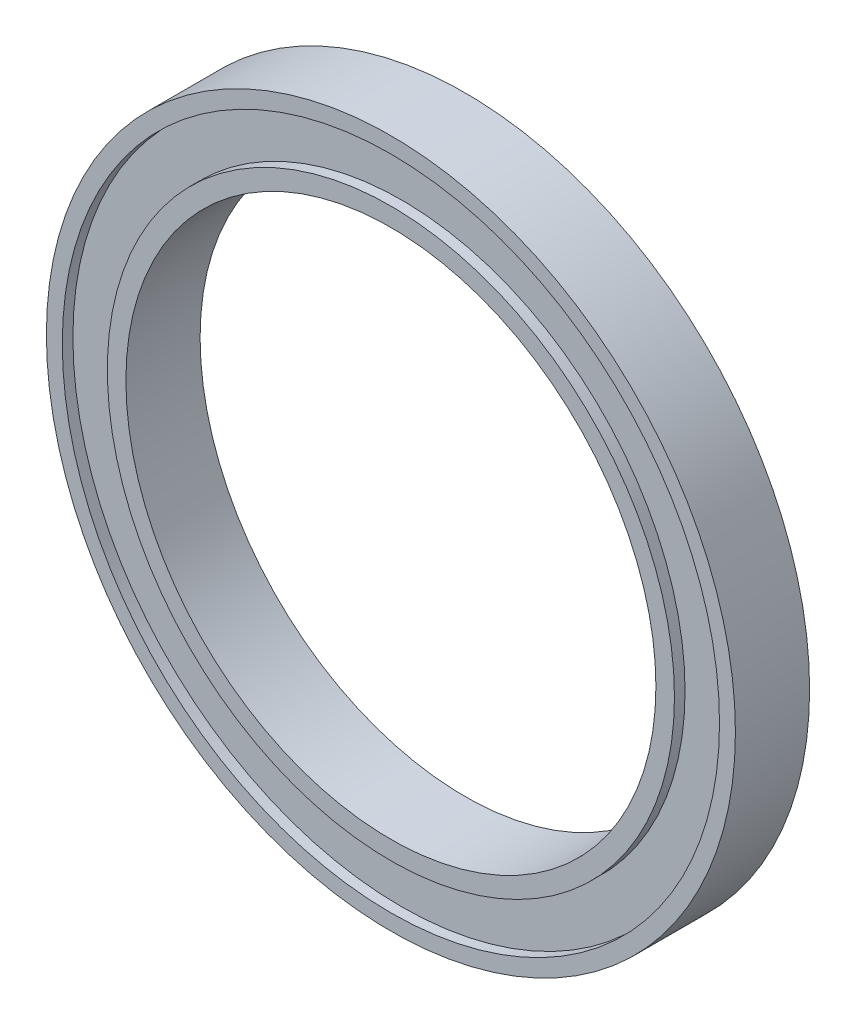
ISO-10303-21;
HEADER;
FILE_DESCRIPTION(('STEP AP214'),'2;1');
FILE_NAME('part.step','',(''),(''),'','','');
FILE_SCHEMA(('AUTOMOTIVE_DESIGN { 1 0 10303 214 1 1 1 1 }'));
ENDSEC;
DATA;
#1=APPLICATION_CONTEXT('core data for automotive mechanical design processes');
#2=APPLICATION_PROTOCOL_DEFINITION('international standard','automotive_design',2000,#1);
#3=PRODUCT_CONTEXT('',#1,'mechanical');
#4=PRODUCT('Part','Part','',(#3));
#5=PRODUCT_RELATED_PRODUCT_CATEGORY('part','',(#4));
#6=PRODUCT_DEFINITION_FORMATION('','',#4);
#7=PRODUCT_DEFINITION_CONTEXT('part definition',#1,'design');
#8=PRODUCT_DEFINITION('design','',#6,#7);
#9=PRODUCT_DEFINITION_SHAPE('','',#8);
#10=(LENGTH_UNIT() NAMED_UNIT(*) SI_UNIT(.MILLI.,.METRE.));
#11=(NAMED_UNIT(*) PLANE_ANGLE_UNIT() SI_UNIT($,.RADIAN.));
#12=(NAMED_UNIT(*) SI_UNIT($,.STERADIAN.) SOLID_ANGLE_UNIT());
#13=UNCERTAINTY_MEASURE_WITH_UNIT(LENGTH_MEASURE(1.E-05),#10,'distance_accuracy_value','');
#14=(GEOMETRIC_REPRESENTATION_CONTEXT(3) GLOBAL_UNCERTAINTY_ASSIGNED_CONTEXT((#13)) GLOBAL_UNIT_ASSIGNED_CONTEXT((#10,
#11,#12)) REPRESENTATION_CONTEXT('',''));
#15=CARTESIAN_POINT('',(0.,0.,0.));
#16=DIRECTION('',(0.,0.,1.));
#17=DIRECTION('',(1.,0.,0.));
#18=AXIS2_PLACEMENT_3D('',#15,#16,#17);
#19=CARTESIAN_POINT('',(0.,0.,-3.5));
#20=DIRECTION('',(0.,0.,1.));
#21=DIRECTION('',(1.,0.,0.));
#22=AXIS2_PLACEMENT_3D('',#19,#20,#21);
#23=PLANE('',#22);
#24=CARTESIAN_POINT('',(0.,0.,-3.5));
#25=DIRECTION('',(0.,0.,1.));
#26=DIRECTION('',(1.,0.,0.));
#27=AXIS2_PLACEMENT_3D('',#24,#25,#26);
#28=CIRCLE('',#27,25.);
#29=CARTESIAN_POINT('',(25.,0.,-3.5));
#30=VERTEX_POINT('',#29);
#31=EDGE_CURVE('E46',#30,#30,#28,.T.);
#32=ORIENTED_EDGE('',*,*,#31,.T.);
#33=EDGE_LOOP('',(#32));
#34=FACE_BOUND('',#33,.T.);
#35=CARTESIAN_POINT('',(0.,0.,-3.5));
#36=DIRECTION('',(0.,0.,1.));
#37=DIRECTION('',(1.,0.,0.));
#38=AXIS2_PLACEMENT_3D('',#35,#36,#37);
#39=CIRCLE('',#38,26.75);
#40=CARTESIAN_POINT('',(26.75,0.,-3.5));
#41=VERTEX_POINT('',#40);
#42=EDGE_CURVE('E70',#41,#41,#39,.T.);
#43=ORIENTED_EDGE('',*,*,#42,.F.);
#44=EDGE_LOOP('',(#43));
#45=FACE_BOUND('',#44,.T.);
#46=ADVANCED_FACE('F33',(#34,#45),#23,.F.);
#47=CARTESIAN_POINT('',(0.,0.,3.5));
#48=DIRECTION('',(0.,0.,1.));
#49=DIRECTION('',(1.,0.,0.));
#50=AXIS2_PLACEMENT_3D('',#47,#48,#49);
#51=PLANE('',#50);
#52=CARTESIAN_POINT('',(0.,0.,3.5));
#53=DIRECTION('',(0.,0.,1.));
#54=DIRECTION('',(1.,0.,0.));
#55=AXIS2_PLACEMENT_3D('',#52,#53,#54);
#56=CIRCLE('',#55,25.);
#57=CARTESIAN_POINT('',(25.,0.,3.5));
#58=VERTEX_POINT('',#57);
#59=EDGE_CURVE('E44',#58,#58,#56,.T.);
#60=ORIENTED_EDGE('',*,*,#59,.F.);
#61=EDGE_LOOP('',(#60));
#62=FACE_BOUND('',#61,.T.);
#63=CARTESIAN_POINT('',(0.,0.,3.5));
#64=DIRECTION('',(0.,0.,1.));
#65=DIRECTION('',(1.,0.,0.));
#66=AXIS2_PLACEMENT_3D('',#63,#64,#65);
#67=CIRCLE('',#66,26.75);
#68=CARTESIAN_POINT('',(26.75,0.,3.5));
#69=VERTEX_POINT('',#68);
#70=EDGE_CURVE('E58',#69,#69,#67,.T.);
#71=ORIENTED_EDGE('',*,*,#70,.T.);
#72=EDGE_LOOP('',(#71));
#73=FACE_BOUND('',#72,.T.);
#74=ADVANCED_FACE('F86',(#62,#73),#51,.T.);
#75=CARTESIAN_POINT('',(0.,0.,3.5));
#76=DIRECTION('',(0.,0.,1.));
#77=DIRECTION('',(1.,0.,0.));
#78=AXIS2_PLACEMENT_3D('',#75,#76,#77);
#79=CIRCLE('',#78,31.);
#80=CARTESIAN_POINT('',(31.,0.,3.5));
#81=VERTEX_POINT('',#80);
#82=EDGE_CURVE('E52',#81,#81,#79,.T.);
#83=ORIENTED_EDGE('',*,*,#82,.F.);
#84=EDGE_LOOP('',(#83));
#85=FACE_BOUND('',#84,.T.);
#86=CARTESIAN_POINT('',(0.,0.,3.5));
#87=DIRECTION('',(0.,0.,1.));
#88=DIRECTION('',(1.,0.,0.));
#89=AXIS2_PLACEMENT_3D('',#86,#87,#88);
#90=CIRCLE('',#89,32.5);
#91=CARTESIAN_POINT('',(32.5,0.,3.5));
#92=VERTEX_POINT('',#91);
#93=EDGE_CURVE('E10',#92,#92,#90,.T.);
#94=ORIENTED_EDGE('',*,*,#93,.T.);
#95=EDGE_LOOP('',(#94));
#96=FACE_BOUND('',#95,.T.);
#97=ADVANCED_FACE('F92',(#85,#96),#51,.T.);
#98=CARTESIAN_POINT('',(0.,0.,-3.5));
#99=DIRECTION('',(0.,0.,1.));
#100=DIRECTION('',(1.,0.,0.));
#101=AXIS2_PLACEMENT_3D('',#98,#99,#100);
#102=CIRCLE('',#101,31.);
#103=CARTESIAN_POINT('',(31.,0.,-3.5));
#104=VERTEX_POINT('',#103);
#105=EDGE_CURVE('E64',#104,#104,#102,.T.);
#106=ORIENTED_EDGE('',*,*,#105,.T.);
#107=EDGE_LOOP('',(#106));
#108=FACE_BOUND('',#107,.T.);
#109=CARTESIAN_POINT('',(0.,0.,-3.5));
#110=DIRECTION('',(0.,0.,1.));
#111=DIRECTION('',(1.,0.,0.));
#112=AXIS2_PLACEMENT_3D('',#109,#110,#111);
#113=CIRCLE('',#112,32.5);
#114=CARTESIAN_POINT('',(32.5,0.,-3.5));
#115=VERTEX_POINT('',#114);
#116=EDGE_CURVE('E37',#115,#115,#113,.T.);
#117=ORIENTED_EDGE('',*,*,#116,.F.);
#118=EDGE_LOOP('',(#117));
#119=FACE_BOUND('',#118,.T.);
#120=ADVANCED_FACE('F88',(#108,#119),#23,.F.);
#121=CARTESIAN_POINT('',(0.,0.,3.5));
#122=DIRECTION('',(0.,0.,-1.));
#123=DIRECTION('',(-1.,0.,0.));
#124=AXIS2_PLACEMENT_3D('',#121,#122,#123);
#125=CYLINDRICAL_SURFACE('',#124,32.5);
#126=ORIENTED_EDGE('',*,*,#93,.F.);
#127=EDGE_LOOP('',(#126));
#128=FACE_BOUND('',#127,.T.);
#129=ORIENTED_EDGE('',*,*,#116,.T.);
#130=EDGE_LOOP('',(#129));
#131=FACE_BOUND('',#130,.T.);
#132=ADVANCED_FACE('F35',(#128,#131),#125,.T.);
#133=CARTESIAN_POINT('',(0.,0.,3.5));
#134=DIRECTION('',(0.,0.,-1.));
#135=DIRECTION('',(-1.,0.,0.));
#136=AXIS2_PLACEMENT_3D('',#133,#134,#135);
#137=CYLINDRICAL_SURFACE('',#136,25.);
#138=ORIENTED_EDGE('',*,*,#59,.T.);
#139=EDGE_LOOP('',(#138));
#140=FACE_BOUND('',#139,.T.);
#141=ORIENTED_EDGE('',*,*,#31,.F.);
#142=EDGE_LOOP('',(#141));
#143=FACE_BOUND('',#142,.T.);
#144=ADVANCED_FACE('F101',(#140,#143),#137,.F.);
#145=CARTESIAN_POINT('',(0.,0.,2.5));
#146=DIRECTION('',(0.,0.,1.));
#147=DIRECTION('',(1.,0.,0.));
#148=AXIS2_PLACEMENT_3D('',#145,#146,#147);
#149=CYLINDRICAL_SURFACE('',#148,31.);
#150=CARTESIAN_POINT('',(0.,0.,2.5));
#151=DIRECTION('',(0.,0.,1.));
#152=DIRECTION('',(1.,0.,0.));
#153=AXIS2_PLACEMENT_3D('',#150,#151,#152);
#154=CIRCLE('',#153,31.);
#155=CARTESIAN_POINT('',(31.,0.,2.5));
#156=VERTEX_POINT('',#155);
#157=EDGE_CURVE('E49',#156,#156,#154,.T.);
#158=ORIENTED_EDGE('',*,*,#157,.F.);
#159=EDGE_LOOP('',(#158));
#160=FACE_BOUND('',#159,.T.);
#161=ORIENTED_EDGE('',*,*,#82,.T.);
#162=EDGE_LOOP('',(#161));
#163=FACE_BOUND('',#162,.T.);
#164=ADVANCED_FACE('F125',(#160,#163),#149,.F.);
#165=CARTESIAN_POINT('',(0.,0.,2.5));
#166=DIRECTION('',(0.,0.,1.));
#167=DIRECTION('',(1.,0.,0.));
#168=AXIS2_PLACEMENT_3D('',#165,#166,#167);
#169=PLANE('',#168);
#170=CARTESIAN_POINT('',(0.,0.,2.5));
#171=DIRECTION('',(0.,0.,1.));
#172=DIRECTION('',(1.,0.,0.));
#173=AXIS2_PLACEMENT_3D('',#170,#171,#172);
#174=CIRCLE('',#173,26.75);
#175=CARTESIAN_POINT('',(26.75,0.,2.5));
#176=VERTEX_POINT('',#175);
#177=EDGE_CURVE('E55',#176,#176,#174,.T.);
#178=ORIENTED_EDGE('',*,*,#177,.F.);
#179=EDGE_LOOP('',(#178));
#180=FACE_BOUND('',#179,.T.);
#181=ORIENTED_EDGE('',*,*,#157,.T.);
#182=EDGE_LOOP('',(#181));
#183=FACE_BOUND('',#182,.T.);
#184=ADVANCED_FACE('F121',(#180,#183),#169,.T.);
#185=CARTESIAN_POINT('',(0.,0.,2.5));
#186=DIRECTION('',(0.,0.,1.));
#187=DIRECTION('',(1.,0.,0.));
#188=AXIS2_PLACEMENT_3D('',#185,#186,#187);
#189=CYLINDRICAL_SURFACE('',#188,26.75);
#190=ORIENTED_EDGE('',*,*,#177,.T.);
#191=EDGE_LOOP('',(#190));
#192=FACE_BOUND('',#191,.T.);
#193=ORIENTED_EDGE('',*,*,#70,.F.);
#194=EDGE_LOOP('',(#193));
#195=FACE_BOUND('',#194,.T.);
#196=ADVANCED_FACE('F115',(#192,#195),#189,.T.);
#197=CARTESIAN_POINT('',(0.,0.,-2.5));
#198=DIRECTION('',(0.,0.,-1.));
#199=DIRECTION('',(1.,0.,0.));
#200=AXIS2_PLACEMENT_3D('',#197,#198,#199);
#201=PLANE('',#200);
#202=CARTESIAN_POINT('',(0.,0.,-2.5));
#203=DIRECTION('',(0.,0.,1.));
#204=DIRECTION('',(1.,0.,0.));
#205=AXIS2_PLACEMENT_3D('',#202,#203,#204);
#206=CIRCLE('',#205,31.);
#207=CARTESIAN_POINT('',(31.,0.,-2.5));
#208=VERTEX_POINT('',#207);
#209=EDGE_CURVE('E61',#208,#208,#206,.T.);
#210=ORIENTED_EDGE('',*,*,#209,.F.);
#211=EDGE_LOOP('',(#210));
#212=FACE_BOUND('',#211,.T.);
#213=CARTESIAN_POINT('',(0.,0.,-2.5));
#214=DIRECTION('',(0.,0.,1.));
#215=DIRECTION('',(1.,0.,0.));
#216=AXIS2_PLACEMENT_3D('',#213,#214,#215);
#217=CIRCLE('',#216,26.75);
#218=CARTESIAN_POINT('',(26.75,0.,-2.5));
#219=VERTEX_POINT('',#218);
#220=EDGE_CURVE('E67',#219,#219,#217,.T.);
#221=ORIENTED_EDGE('',*,*,#220,.T.);
#222=EDGE_LOOP('',(#221));
#223=FACE_BOUND('',#222,.T.);
#224=ADVANCED_FACE('F76',(#212,#223),#201,.T.);
#225=CARTESIAN_POINT('',(0.,0.,-2.5));
#226=DIRECTION('',(0.,0.,-1.));
#227=DIRECTION('',(-1.,0.,0.));
#228=AXIS2_PLACEMENT_3D('',#225,#226,#227);
#229=CYLINDRICAL_SURFACE('',#228,31.);
#230=ORIENTED_EDGE('',*,*,#209,.T.);
#231=EDGE_LOOP('',(#230));
#232=FACE_BOUND('',#231,.T.);
#233=ORIENTED_EDGE('',*,*,#105,.F.);
#234=EDGE_LOOP('',(#233));
#235=FACE_BOUND('',#234,.T.);
#236=ADVANCED_FACE('F81',(#232,#235),#229,.F.);
#237=CARTESIAN_POINT('',(0.,0.,-2.5));
#238=DIRECTION('',(0.,0.,-1.));
#239=DIRECTION('',(-1.,0.,0.));
#240=AXIS2_PLACEMENT_3D('',#237,#238,#239);
#241=CYLINDRICAL_SURFACE('',#240,26.75);
#242=ORIENTED_EDGE('',*,*,#220,.F.);
#243=EDGE_LOOP('',(#242));
#244=FACE_BOUND('',#243,.T.);
#245=ORIENTED_EDGE('',*,*,#42,.T.);
#246=EDGE_LOOP('',(#245));
#247=FACE_BOUND('',#246,.T.);
#248=ADVANCED_FACE('F78',(#244,#247),#241,.T.);
#249=CLOSED_SHELL('',(#46,#74,#97,#120,#132,#144,#164,#184,#196,#224,#236,#248));
#250=MANIFOLD_SOLID_BREP('B2',#249);
#251=ADVANCED_BREP_SHAPE_REPRESENTATION('',(#18,#250),#14);
#252=SHAPE_DEFINITION_REPRESENTATION(#9,#251);
ENDSEC;
END-ISO-10303-21;
